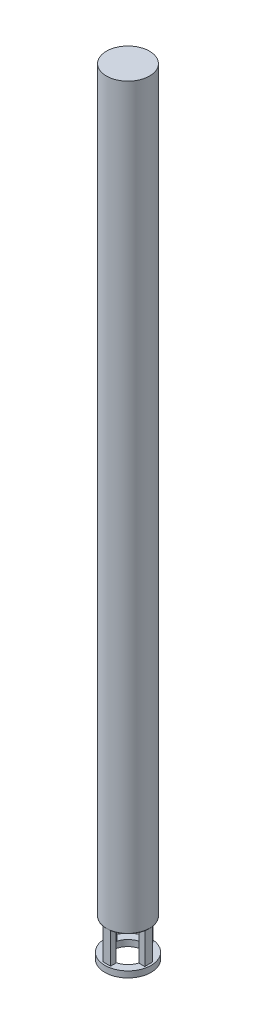
ISO-10303-21;
HEADER;
FILE_DESCRIPTION(('STEP AP214'),'2;1');
FILE_NAME('part.step','',(''),(''),'','','');
FILE_SCHEMA(('AUTOMOTIVE_DESIGN { 1 0 10303 214 1 1 1 1 }'));
ENDSEC;
DATA;
#1=APPLICATION_CONTEXT('core data for automotive mechanical design processes');
#2=APPLICATION_PROTOCOL_DEFINITION('international standard','automotive_design',2000,#1);
#3=PRODUCT_CONTEXT('',#1,'mechanical');
#4=PRODUCT('Part','Part','',(#3));
#5=PRODUCT_RELATED_PRODUCT_CATEGORY('part','',(#4));
#6=PRODUCT_DEFINITION_FORMATION('','',#4);
#7=PRODUCT_DEFINITION_CONTEXT('part definition',#1,'design');
#8=PRODUCT_DEFINITION('design','',#6,#7);
#9=PRODUCT_DEFINITION_SHAPE('','',#8);
#10=(LENGTH_UNIT() NAMED_UNIT(*) SI_UNIT(.MILLI.,.METRE.));
#11=(NAMED_UNIT(*) PLANE_ANGLE_UNIT() SI_UNIT($,.RADIAN.));
#12=(NAMED_UNIT(*) SI_UNIT($,.STERADIAN.) SOLID_ANGLE_UNIT());
#13=UNCERTAINTY_MEASURE_WITH_UNIT(LENGTH_MEASURE(1.E-05),#10,'distance_accuracy_value','');
#14=(GEOMETRIC_REPRESENTATION_CONTEXT(3) GLOBAL_UNCERTAINTY_ASSIGNED_CONTEXT((#13)) GLOBAL_UNIT_ASSIGNED_CONTEXT((#10,
#11,#12)) REPRESENTATION_CONTEXT('',''));
#15=CARTESIAN_POINT('',(0.,0.,0.));
#16=DIRECTION('',(0.,0.,1.));
#17=DIRECTION('',(1.,0.,0.));
#18=AXIS2_PLACEMENT_3D('',#15,#16,#17);
#19=CARTESIAN_POINT('',(0.,-5.,0.));
#20=DIRECTION('',(0.,1.,0.));
#21=DIRECTION('',(0.,0.,1.));
#22=AXIS2_PLACEMENT_3D('',#19,#20,#21);
#23=PLANE('',#22);
#24=DIRECTION('',(0.,0.,-1.));
#25=VECTOR('',#24,1.);
#26=CARTESIAN_POINT('',(-0.674999999999977,-5.,3.4));
#27=LINE('',#26,#25);
#28=CARTESIAN_POINT('',(-0.674999999999977,-5.,3.4));
#29=VERTEX_POINT('',#28);
#30=CARTESIAN_POINT('',(-0.674999999999983,-5.,2.5));
#31=VERTEX_POINT('',#30);
#32=EDGE_CURVE('E67',#29,#31,#27,.T.);
#33=ORIENTED_EDGE('',*,*,#32,.T.);
#34=DIRECTION('',(1.,0.,0.));
#35=VECTOR('',#34,1.);
#36=CARTESIAN_POINT('',(-0.674999999999983,-5.,2.5));
#37=LINE('',#36,#35);
#38=CARTESIAN_POINT('',(0.,-5.,2.5));
#39=VERTEX_POINT('',#38);
#40=EDGE_CURVE('E546',#31,#39,#37,.T.);
#41=ORIENTED_EDGE('',*,*,#40,.T.);
#42=CARTESIAN_POINT('',(0.,-5.,0.));
#43=DIRECTION('',(0.,1.,0.));
#44=DIRECTION('',(0.,0.,1.));
#45=AXIS2_PLACEMENT_3D('',#42,#43,#44);
#46=CIRCLE('',#45,2.5);
#47=CARTESIAN_POINT('',(-2.5,-5.,0.));
#48=VERTEX_POINT('',#47);
#49=EDGE_CURVE('E554',#48,#39,#46,.T.);
#50=ORIENTED_EDGE('',*,*,#49,.F.);
#51=DIRECTION('',(0.,0.,1.));
#52=VECTOR('',#51,1.);
#53=CARTESIAN_POINT('',(-2.5,-5.,-0.674999999999988));
#54=LINE('',#53,#52);
#55=CARTESIAN_POINT('',(-2.5,-5.,0.575000000000012));
#56=VERTEX_POINT('',#55);
#57=EDGE_CURVE('E216',#48,#56,#54,.T.);
#58=ORIENTED_EDGE('',*,*,#57,.T.);
#59=DIRECTION('',(-1.,0.,0.));
#60=VECTOR('',#59,1.);
#61=CARTESIAN_POINT('',(-3.4,-5.,0.575000000000016));
#62=LINE('',#61,#60);
#63=CARTESIAN_POINT('',(-3.4,-5.,0.575000000000016));
#64=VERTEX_POINT('',#63);
#65=EDGE_CURVE('E220',#56,#64,#62,.T.);
#66=ORIENTED_EDGE('',*,*,#65,.T.);
#67=DIRECTION('',(0.,0.,-1.));
#68=VECTOR('',#67,1.);
#69=CARTESIAN_POINT('',(-3.4,-5.,-0.674999999999984));
#70=LINE('',#69,#68);
#71=CARTESIAN_POINT('',(-3.4,-5.,-0.674999999999984));
#72=VERTEX_POINT('',#71);
#73=EDGE_CURVE('E218',#64,#72,#70,.T.);
#74=ORIENTED_EDGE('',*,*,#73,.T.);
#75=DIRECTION('',(1.,0.,0.));
#76=VECTOR('',#75,1.);
#77=CARTESIAN_POINT('',(-3.4,-5.,-0.674999999999984));
#78=LINE('',#77,#76);
#79=CARTESIAN_POINT('',(-2.5,-5.,-0.674999999999988));
#80=VERTEX_POINT('',#79);
#81=EDGE_CURVE('E215',#72,#80,#78,.T.);
#82=ORIENTED_EDGE('',*,*,#81,.T.);
#83=EDGE_CURVE('E213',#80,#48,#54,.T.);
#84=ORIENTED_EDGE('',*,*,#83,.T.);
#85=CARTESIAN_POINT('',(0.,-5.,-2.5));
#86=VERTEX_POINT('',#85);
#87=EDGE_CURVE('E304',#86,#48,#46,.T.);
#88=ORIENTED_EDGE('',*,*,#87,.F.);
#89=DIRECTION('',(-1.,0.,0.));
#90=VECTOR('',#89,1.);
#91=CARTESIAN_POINT('',(0.674999999999994,-5.,-2.5));
#92=LINE('',#91,#90);
#93=CARTESIAN_POINT('',(-0.575000000000006,-5.,-2.5));
#94=VERTEX_POINT('',#93);
#95=EDGE_CURVE('E245',#86,#94,#92,.T.);
#96=ORIENTED_EDGE('',*,*,#95,.T.);
#97=DIRECTION('',(0.,0.,-1.));
#98=VECTOR('',#97,1.);
#99=CARTESIAN_POINT('',(-0.575000000000008,-5.,-3.4));
#100=LINE('',#99,#98);
#101=CARTESIAN_POINT('',(-0.575000000000008,-5.,-3.4));
#102=VERTEX_POINT('',#101);
#103=EDGE_CURVE('E249',#94,#102,#100,.T.);
#104=ORIENTED_EDGE('',*,*,#103,.T.);
#105=DIRECTION('',(1.,0.,0.));
#106=VECTOR('',#105,1.);
#107=CARTESIAN_POINT('',(0.674999999999992,-5.,-3.4));
#108=LINE('',#107,#106);
#109=CARTESIAN_POINT('',(0.674999999999992,-5.,-3.4));
#110=VERTEX_POINT('',#109);
#111=EDGE_CURVE('E247',#102,#110,#108,.T.);
#112=ORIENTED_EDGE('',*,*,#111,.T.);
#113=DIRECTION('',(0.,0.,1.));
#114=VECTOR('',#113,1.);
#115=CARTESIAN_POINT('',(0.674999999999992,-5.,-3.4));
#116=LINE('',#115,#114);
#117=CARTESIAN_POINT('',(0.674999999999994,-5.,-2.5));
#118=VERTEX_POINT('',#117);
#119=EDGE_CURVE('E244',#110,#118,#116,.T.);
#120=ORIENTED_EDGE('',*,*,#119,.T.);
#121=EDGE_CURVE('E242',#118,#86,#92,.T.);
#122=ORIENTED_EDGE('',*,*,#121,.T.);
#123=CARTESIAN_POINT('',(2.5,-5.,0.));
#124=VERTEX_POINT('',#123);
#125=EDGE_CURVE('E301',#124,#86,#46,.T.);
#126=ORIENTED_EDGE('',*,*,#125,.F.);
#127=DIRECTION('',(0.,0.,-1.));
#128=VECTOR('',#127,1.);
#129=CARTESIAN_POINT('',(2.5,-5.,0.675));
#130=LINE('',#129,#128);
#131=CARTESIAN_POINT('',(2.5,-5.,-0.575));
#132=VERTEX_POINT('',#131);
#133=EDGE_CURVE('E12',#124,#132,#130,.T.);
#134=ORIENTED_EDGE('',*,*,#133,.T.);
#135=DIRECTION('',(1.,0.,0.));
#136=VECTOR('',#135,1.);
#137=CARTESIAN_POINT('',(3.4,-5.,-0.575));
#138=LINE('',#137,#136);
#139=CARTESIAN_POINT('',(3.4,-5.,-0.575));
#140=VERTEX_POINT('',#139);
#141=EDGE_CURVE('E279',#132,#140,#138,.T.);
#142=ORIENTED_EDGE('',*,*,#141,.T.);
#143=DIRECTION('',(0.,0.,1.));
#144=VECTOR('',#143,1.);
#145=CARTESIAN_POINT('',(3.4,-5.,0.675));
#146=LINE('',#145,#144);
#147=CARTESIAN_POINT('',(3.4,-5.,0.675));
#148=VERTEX_POINT('',#147);
#149=EDGE_CURVE('E276',#140,#148,#146,.T.);
#150=ORIENTED_EDGE('',*,*,#149,.T.);
#151=DIRECTION('',(-1.,0.,0.));
#152=VECTOR('',#151,1.);
#153=CARTESIAN_POINT('',(3.4,-5.,0.675));
#154=LINE('',#153,#152);
#155=CARTESIAN_POINT('',(2.5,-5.,0.675));
#156=VERTEX_POINT('',#155);
#157=EDGE_CURVE('E272',#148,#156,#154,.T.);
#158=ORIENTED_EDGE('',*,*,#157,.T.);
#159=EDGE_CURVE('E60',#156,#124,#130,.T.);
#160=ORIENTED_EDGE('',*,*,#159,.T.);
#161=EDGE_CURVE('E305',#39,#124,#46,.T.);
#162=ORIENTED_EDGE('',*,*,#161,.F.);
#163=CARTESIAN_POINT('',(0.575000000000017,-5.,2.5));
#164=VERTEX_POINT('',#163);
#165=EDGE_CURVE('E206',#39,#164,#37,.T.);
#166=ORIENTED_EDGE('',*,*,#165,.T.);
#167=DIRECTION('',(0.,0.,1.));
#168=VECTOR('',#167,1.);
#169=CARTESIAN_POINT('',(0.575000000000023,-5.,3.4));
#170=LINE('',#169,#168);
#171=CARTESIAN_POINT('',(0.575000000000023,-5.,3.4));
#172=VERTEX_POINT('',#171);
#173=EDGE_CURVE('E210',#164,#172,#170,.T.);
#174=ORIENTED_EDGE('',*,*,#173,.T.);
#175=DIRECTION('',(-1.,0.,0.));
#176=VECTOR('',#175,1.);
#177=CARTESIAN_POINT('',(-0.674999999999977,-5.,3.4));
#178=LINE('',#177,#176);
#179=EDGE_CURVE('E72',#172,#29,#178,.T.);
#180=ORIENTED_EDGE('',*,*,#179,.T.);
#181=EDGE_LOOP('',(#33,#41,#50,#58,#66,#74,#82,#84,#88,#96,#104,#112,#120,#122,#126,#134,#142,
#150,#158,#160,#162,#166,#174,#180));
#182=FACE_BOUND('',#181,.T.);
#183=CARTESIAN_POINT('',(0.,-5.,0.));
#184=DIRECTION('',(0.,1.,0.));
#185=DIRECTION('',(0.,0.,1.));
#186=AXIS2_PLACEMENT_3D('',#183,#184,#185);
#187=CIRCLE('',#186,3.75);
#188=CARTESIAN_POINT('',(0.,-5.,3.75));
#189=VERTEX_POINT('',#188);
#190=EDGE_CURVE('E58',#189,#189,#187,.T.);
#191=ORIENTED_EDGE('',*,*,#190,.T.);
#192=EDGE_LOOP('',(#191));
#193=FACE_BOUND('',#192,.T.);
#194=ADVANCED_FACE('F49',(#182,#193),#23,.T.);
#195=CARTESIAN_POINT('',(0.,-6.,0.));
#196=DIRECTION('',(0.,1.,0.));
#197=DIRECTION('',(0.,0.,1.));
#198=AXIS2_PLACEMENT_3D('',#195,#196,#197);
#199=PLANE('',#198);
#200=CARTESIAN_POINT('',(0.,-6.,0.));
#201=DIRECTION('',(0.,1.,0.));
#202=DIRECTION('',(0.,0.,1.));
#203=AXIS2_PLACEMENT_3D('',#200,#201,#202);
#204=CIRCLE('',#203,3.75);
#205=CARTESIAN_POINT('',(0.,-6.,3.75));
#206=VERTEX_POINT('',#205);
#207=EDGE_CURVE('E53',#206,#206,#204,.T.);
#208=ORIENTED_EDGE('',*,*,#207,.F.);
#209=EDGE_LOOP('',(#208));
#210=FACE_BOUND('',#209,.T.);
#211=CARTESIAN_POINT('',(0.,-6.,0.));
#212=DIRECTION('',(0.,1.,0.));
#213=DIRECTION('',(0.,0.,1.));
#214=AXIS2_PLACEMENT_3D('',#211,#212,#213);
#215=CIRCLE('',#214,2.5);
#216=CARTESIAN_POINT('',(0.,-6.,2.5));
#217=VERTEX_POINT('',#216);
#218=EDGE_CURVE('E300',#217,#217,#215,.T.);
#219=ORIENTED_EDGE('',*,*,#218,.T.);
#220=EDGE_LOOP('',(#219));
#221=FACE_BOUND('',#220,.T.);
#222=ADVANCED_FACE('F314',(#210,#221),#199,.F.);
#223=CARTESIAN_POINT('',(0.,-5.,0.));
#224=DIRECTION('',(0.,-1.,0.));
#225=DIRECTION('',(0.,0.,-1.));
#226=AXIS2_PLACEMENT_3D('',#223,#224,#225);
#227=CYLINDRICAL_SURFACE('',#226,3.75);
#228=ORIENTED_EDGE('',*,*,#190,.F.);
#229=EDGE_LOOP('',(#228));
#230=FACE_BOUND('',#229,.T.);
#231=ORIENTED_EDGE('',*,*,#207,.T.);
#232=EDGE_LOOP('',(#231));
#233=FACE_BOUND('',#232,.T.);
#234=ADVANCED_FACE('F51',(#230,#233),#227,.T.);
#235=CARTESIAN_POINT('',(0.,-5.,0.));
#236=DIRECTION('',(0.,-1.,0.));
#237=DIRECTION('',(0.,0.,-1.));
#238=AXIS2_PLACEMENT_3D('',#235,#236,#237);
#239=CYLINDRICAL_SURFACE('',#238,2.5);
#240=ORIENTED_EDGE('',*,*,#125,.T.);
#241=ORIENTED_EDGE('',*,*,#87,.T.);
#242=ORIENTED_EDGE('',*,*,#49,.T.);
#243=ORIENTED_EDGE('',*,*,#161,.T.);
#244=EDGE_LOOP('',(#240,#241,#242,#243));
#245=FACE_BOUND('',#244,.T.);
#246=ORIENTED_EDGE('',*,*,#218,.F.);
#247=EDGE_LOOP('',(#246));
#248=FACE_BOUND('',#247,.T.);
#249=ADVANCED_FACE('F319',(#245,#248),#239,.F.);
#250=CARTESIAN_POINT('',(3.4,-6.54029218007494,0.675));
#251=DIRECTION('',(1.,0.,0.));
#252=DIRECTION('',(0.,0.,-1.));
#253=AXIS2_PLACEMENT_3D('',#250,#251,#252);
#254=PLANE('',#253);
#255=ORIENTED_EDGE('',*,*,#149,.F.);
#256=DIRECTION('',(0.,1.,0.));
#257=VECTOR('',#256,1.);
#258=CARTESIAN_POINT('',(3.4,-6.54029218007494,-0.575));
#259=LINE('',#258,#257);
#260=CARTESIAN_POINT('',(3.4,0.,-0.575));
#261=VERTEX_POINT('',#260);
#262=EDGE_CURVE('E291',#140,#261,#259,.T.);
#263=ORIENTED_EDGE('',*,*,#262,.T.);
#264=DIRECTION('',(0.,0.,-1.));
#265=VECTOR('',#264,1.);
#266=CARTESIAN_POINT('',(3.4,0.,0.675));
#267=LINE('',#266,#265);
#268=CARTESIAN_POINT('',(3.4,0.,0.675));
#269=VERTEX_POINT('',#268);
#270=EDGE_CURVE('E269',#269,#261,#267,.T.);
#271=ORIENTED_EDGE('',*,*,#270,.F.);
#272=DIRECTION('',(0.,1.,0.));
#273=VECTOR('',#272,1.);
#274=CARTESIAN_POINT('',(3.4,-6.54029218007494,0.675));
#275=LINE('',#274,#273);
#276=EDGE_CURVE('E273',#148,#269,#275,.T.);
#277=ORIENTED_EDGE('',*,*,#276,.F.);
#278=EDGE_LOOP('',(#255,#263,#271,#277));
#279=FACE_BOUND('',#278,.T.);
#280=ADVANCED_FACE('F321',(#279),#254,.T.);
#281=CARTESIAN_POINT('',(3.4,-6.54029218007494,0.675));
#282=DIRECTION('',(0.,0.,1.));
#283=DIRECTION('',(1.,0.,0.));
#284=AXIS2_PLACEMENT_3D('',#281,#282,#283);
#285=PLANE('',#284);
#286=ORIENTED_EDGE('',*,*,#157,.F.);
#287=ORIENTED_EDGE('',*,*,#276,.T.);
#288=DIRECTION('',(1.,0.,0.));
#289=VECTOR('',#288,1.);
#290=CARTESIAN_POINT('',(3.4,0.,0.675));
#291=LINE('',#290,#289);
#292=CARTESIAN_POINT('',(2.5,0.,0.675));
#293=VERTEX_POINT('',#292);
#294=EDGE_CURVE('E288',#293,#269,#291,.T.);
#295=ORIENTED_EDGE('',*,*,#294,.F.);
#296=DIRECTION('',(0.,1.,0.));
#297=VECTOR('',#296,1.);
#298=CARTESIAN_POINT('',(2.5,-6.54029218007494,0.675));
#299=LINE('',#298,#297);
#300=EDGE_CURVE('E293',#156,#293,#299,.T.);
#301=ORIENTED_EDGE('',*,*,#300,.F.);
#302=EDGE_LOOP('',(#286,#287,#295,#301));
#303=FACE_BOUND('',#302,.T.);
#304=ADVANCED_FACE('F329',(#303),#285,.T.);
#305=CARTESIAN_POINT('',(2.5,-6.54029218007494,0.675));
#306=DIRECTION('',(-1.,0.,0.));
#307=DIRECTION('',(0.,0.,1.));
#308=AXIS2_PLACEMENT_3D('',#305,#306,#307);
#309=PLANE('',#308);
#310=ORIENTED_EDGE('',*,*,#159,.F.);
#311=ORIENTED_EDGE('',*,*,#300,.T.);
#312=DIRECTION('',(0.,0.,1.));
#313=VECTOR('',#312,1.);
#314=CARTESIAN_POINT('',(2.5,0.,0.675));
#315=LINE('',#314,#313);
#316=CARTESIAN_POINT('',(2.5,0.,-0.575));
#317=VERTEX_POINT('',#316);
#318=EDGE_CURVE('E285',#317,#293,#315,.T.);
#319=ORIENTED_EDGE('',*,*,#318,.F.);
#320=DIRECTION('',(0.,1.,0.));
#321=VECTOR('',#320,1.);
#322=CARTESIAN_POINT('',(2.5,-6.54029218007494,-0.575));
#323=LINE('',#322,#321);
#324=EDGE_CURVE('E295',#132,#317,#323,.T.);
#325=ORIENTED_EDGE('',*,*,#324,.F.);
#326=ORIENTED_EDGE('',*,*,#133,.F.);
#327=EDGE_LOOP('',(#310,#311,#319,#325,#326));
#328=FACE_BOUND('',#327,.T.);
#329=ADVANCED_FACE('F357',(#328),#309,.T.);
#330=CARTESIAN_POINT('',(3.4,-6.54029218007494,-0.575));
#331=DIRECTION('',(0.,0.,-1.));
#332=DIRECTION('',(-1.,0.,0.));
#333=AXIS2_PLACEMENT_3D('',#330,#331,#332);
#334=PLANE('',#333);
#335=ORIENTED_EDGE('',*,*,#141,.F.);
#336=ORIENTED_EDGE('',*,*,#324,.T.);
#337=DIRECTION('',(-1.,0.,0.));
#338=VECTOR('',#337,1.);
#339=CARTESIAN_POINT('',(3.4,0.,-0.575));
#340=LINE('',#339,#338);
#341=EDGE_CURVE('E282',#261,#317,#340,.T.);
#342=ORIENTED_EDGE('',*,*,#341,.F.);
#343=ORIENTED_EDGE('',*,*,#262,.F.);
#344=EDGE_LOOP('',(#335,#336,#342,#343));
#345=FACE_BOUND('',#344,.T.);
#346=ADVANCED_FACE('F347',(#345),#334,.T.);
#347=CARTESIAN_POINT('',(0.,0.,0.));
#348=DIRECTION('',(0.,1.,0.));
#349=DIRECTION('',(0.,0.,1.));
#350=AXIS2_PLACEMENT_3D('',#347,#348,#349);
#351=PLANE('',#350);
#352=ORIENTED_EDGE('',*,*,#270,.T.);
#353=ORIENTED_EDGE('',*,*,#341,.T.);
#354=ORIENTED_EDGE('',*,*,#318,.T.);
#355=ORIENTED_EDGE('',*,*,#294,.T.);
#356=EDGE_LOOP('',(#352,#353,#354,#355));
#357=FACE_BOUND('',#356,.T.);
#358=ADVANCED_FACE('F342',(#357),#351,.T.);
#359=CARTESIAN_POINT('',(0.674999999999992,-6.54029218007494,-3.4));
#360=DIRECTION('',(0.,0.,-1.));
#361=DIRECTION('',(-1.,0.,0.));
#362=AXIS2_PLACEMENT_3D('',#359,#360,#361);
#363=PLANE('',#362);
#364=ORIENTED_EDGE('',*,*,#111,.F.);
#365=DIRECTION('',(0.,1.,0.));
#366=VECTOR('',#365,1.);
#367=CARTESIAN_POINT('',(-0.575000000000008,-6.54029218007494,-3.4));
#368=LINE('',#367,#366);
#369=CARTESIAN_POINT('',(-0.575000000000008,0.,-3.4));
#370=VERTEX_POINT('',#369);
#371=EDGE_CURVE('E261',#102,#370,#368,.T.);
#372=ORIENTED_EDGE('',*,*,#371,.T.);
#373=DIRECTION('',(-1.,0.,0.));
#374=VECTOR('',#373,1.);
#375=CARTESIAN_POINT('',(0.674999999999992,0.,-3.4));
#376=LINE('',#375,#374);
#377=CARTESIAN_POINT('',(0.674999999999992,0.,-3.4));
#378=VERTEX_POINT('',#377);
#379=EDGE_CURVE('E241',#378,#370,#376,.T.);
#380=ORIENTED_EDGE('',*,*,#379,.F.);
#381=DIRECTION('',(0.,1.,0.));
#382=VECTOR('',#381,1.);
#383=CARTESIAN_POINT('',(0.674999999999992,-6.54029218007494,-3.4));
#384=LINE('',#383,#382);
#385=EDGE_CURVE('E262',#110,#378,#384,.T.);
#386=ORIENTED_EDGE('',*,*,#385,.F.);
#387=EDGE_LOOP('',(#364,#372,#380,#386));
#388=FACE_BOUND('',#387,.T.);
#389=ADVANCED_FACE('F346',(#388),#363,.T.);
#390=CARTESIAN_POINT('',(0.674999999999992,-6.54029218007494,-3.4));
#391=DIRECTION('',(1.,0.,0.));
#392=DIRECTION('',(0.,0.,-1.));
#393=AXIS2_PLACEMENT_3D('',#390,#391,#392);
#394=PLANE('',#393);
#395=ORIENTED_EDGE('',*,*,#119,.F.);
#396=ORIENTED_EDGE('',*,*,#385,.T.);
#397=DIRECTION('',(0.,0.,-1.));
#398=VECTOR('',#397,1.);
#399=CARTESIAN_POINT('',(0.674999999999992,0.,-3.4));
#400=LINE('',#399,#398);
#401=CARTESIAN_POINT('',(0.674999999999994,0.,-2.5));
#402=VERTEX_POINT('',#401);
#403=EDGE_CURVE('E258',#402,#378,#400,.T.);
#404=ORIENTED_EDGE('',*,*,#403,.F.);
#405=DIRECTION('',(0.,1.,0.));
#406=VECTOR('',#405,1.);
#407=CARTESIAN_POINT('',(0.674999999999994,-6.54029218007494,-2.5));
#408=LINE('',#407,#406);
#409=EDGE_CURVE('E264',#118,#402,#408,.T.);
#410=ORIENTED_EDGE('',*,*,#409,.F.);
#411=EDGE_LOOP('',(#395,#396,#404,#410));
#412=FACE_BOUND('',#411,.T.);
#413=ADVANCED_FACE('F407',(#412),#394,.T.);
#414=CARTESIAN_POINT('',(0.674999999999994,-6.54029218007494,-2.5));
#415=DIRECTION('',(0.,0.,1.));
#416=DIRECTION('',(1.,0.,0.));
#417=AXIS2_PLACEMENT_3D('',#414,#415,#416);
#418=PLANE('',#417);
#419=ORIENTED_EDGE('',*,*,#121,.F.);
#420=ORIENTED_EDGE('',*,*,#409,.T.);
#421=DIRECTION('',(1.,0.,0.));
#422=VECTOR('',#421,1.);
#423=CARTESIAN_POINT('',(0.674999999999994,0.,-2.5));
#424=LINE('',#423,#422);
#425=CARTESIAN_POINT('',(-0.575000000000006,0.,-2.5));
#426=VERTEX_POINT('',#425);
#427=EDGE_CURVE('E255',#426,#402,#424,.T.);
#428=ORIENTED_EDGE('',*,*,#427,.F.);
#429=DIRECTION('',(0.,1.,0.));
#430=VECTOR('',#429,1.);
#431=CARTESIAN_POINT('',(-0.575000000000006,-6.54029218007494,-2.5));
#432=LINE('',#431,#430);
#433=EDGE_CURVE('E266',#94,#426,#432,.T.);
#434=ORIENTED_EDGE('',*,*,#433,.F.);
#435=ORIENTED_EDGE('',*,*,#95,.F.);
#436=EDGE_LOOP('',(#419,#420,#428,#434,#435));
#437=FACE_BOUND('',#436,.T.);
#438=ADVANCED_FACE('F416',(#437),#418,.T.);
#439=CARTESIAN_POINT('',(-0.575000000000008,-6.54029218007494,-3.4));
#440=DIRECTION('',(-1.,0.,0.));
#441=DIRECTION('',(0.,0.,1.));
#442=AXIS2_PLACEMENT_3D('',#439,#440,#441);
#443=PLANE('',#442);
#444=ORIENTED_EDGE('',*,*,#103,.F.);
#445=ORIENTED_EDGE('',*,*,#433,.T.);
#446=DIRECTION('',(0.,0.,1.));
#447=VECTOR('',#446,1.);
#448=CARTESIAN_POINT('',(-0.575000000000008,0.,-3.4));
#449=LINE('',#448,#447);
#450=EDGE_CURVE('E252',#370,#426,#449,.T.);
#451=ORIENTED_EDGE('',*,*,#450,.F.);
#452=ORIENTED_EDGE('',*,*,#371,.F.);
#453=EDGE_LOOP('',(#444,#445,#451,#452));
#454=FACE_BOUND('',#453,.T.);
#455=ADVANCED_FACE('F425',(#454),#443,.T.);
#456=CARTESIAN_POINT('',(0.,0.,0.));
#457=DIRECTION('',(0.,1.,0.));
#458=DIRECTION('',(1.,0.,0.));
#459=AXIS2_PLACEMENT_3D('',#456,#457,#458);
#460=PLANE('',#459);
#461=ORIENTED_EDGE('',*,*,#379,.T.);
#462=ORIENTED_EDGE('',*,*,#450,.T.);
#463=ORIENTED_EDGE('',*,*,#427,.T.);
#464=ORIENTED_EDGE('',*,*,#403,.T.);
#465=EDGE_LOOP('',(#461,#462,#463,#464));
#466=FACE_BOUND('',#465,.T.);
#467=ADVANCED_FACE('F434',(#466),#460,.T.);
#468=CARTESIAN_POINT('',(-3.4,-6.54029218007494,-0.674999999999984));
#469=DIRECTION('',(-1.,0.,0.));
#470=DIRECTION('',(0.,0.,1.));
#471=AXIS2_PLACEMENT_3D('',#468,#469,#470);
#472=PLANE('',#471);
#473=ORIENTED_EDGE('',*,*,#73,.F.);
#474=DIRECTION('',(0.,1.,0.));
#475=VECTOR('',#474,1.);
#476=CARTESIAN_POINT('',(-3.4,-6.54029218007494,0.575000000000016));
#477=LINE('',#476,#475);
#478=CARTESIAN_POINT('',(-3.4,0.,0.575000000000016));
#479=VERTEX_POINT('',#478);
#480=EDGE_CURVE('E232',#64,#479,#477,.T.);
#481=ORIENTED_EDGE('',*,*,#480,.T.);
#482=DIRECTION('',(0.,0.,1.));
#483=VECTOR('',#482,1.);
#484=CARTESIAN_POINT('',(-3.4,0.,-0.674999999999984));
#485=LINE('',#484,#483);
#486=CARTESIAN_POINT('',(-3.4,0.,-0.674999999999984));
#487=VERTEX_POINT('',#486);
#488=EDGE_CURVE('E212',#487,#479,#485,.T.);
#489=ORIENTED_EDGE('',*,*,#488,.F.);
#490=DIRECTION('',(0.,1.,0.));
#491=VECTOR('',#490,1.);
#492=CARTESIAN_POINT('',(-3.4,-6.54029218007494,-0.674999999999984));
#493=LINE('',#492,#491);
#494=EDGE_CURVE('E233',#72,#487,#493,.T.);
#495=ORIENTED_EDGE('',*,*,#494,.F.);
#496=EDGE_LOOP('',(#473,#481,#489,#495));
#497=FACE_BOUND('',#496,.T.);
#498=ADVANCED_FACE('F443',(#497),#472,.T.);
#499=CARTESIAN_POINT('',(-3.4,-6.54029218007494,-0.674999999999984));
#500=DIRECTION('',(0.,0.,-1.));
#501=DIRECTION('',(-1.,0.,0.));
#502=AXIS2_PLACEMENT_3D('',#499,#500,#501);
#503=PLANE('',#502);
#504=ORIENTED_EDGE('',*,*,#81,.F.);
#505=ORIENTED_EDGE('',*,*,#494,.T.);
#506=DIRECTION('',(-1.,0.,0.));
#507=VECTOR('',#506,1.);
#508=CARTESIAN_POINT('',(-3.4,0.,-0.674999999999984));
#509=LINE('',#508,#507);
#510=CARTESIAN_POINT('',(-2.5,0.,-0.674999999999988));
#511=VERTEX_POINT('',#510);
#512=EDGE_CURVE('E229',#511,#487,#509,.T.);
#513=ORIENTED_EDGE('',*,*,#512,.F.);
#514=DIRECTION('',(0.,1.,0.));
#515=VECTOR('',#514,1.);
#516=CARTESIAN_POINT('',(-2.5,-6.54029218007494,-0.674999999999988));
#517=LINE('',#516,#515);
#518=EDGE_CURVE('E235',#80,#511,#517,.T.);
#519=ORIENTED_EDGE('',*,*,#518,.F.);
#520=EDGE_LOOP('',(#504,#505,#513,#519));
#521=FACE_BOUND('',#520,.T.);
#522=ADVANCED_FACE('F452',(#521),#503,.T.);
#523=CARTESIAN_POINT('',(-2.5,-6.54029218007494,-0.674999999999988));
#524=DIRECTION('',(1.,0.,0.));
#525=DIRECTION('',(0.,0.,-1.));
#526=AXIS2_PLACEMENT_3D('',#523,#524,#525);
#527=PLANE('',#526);
#528=ORIENTED_EDGE('',*,*,#83,.F.);
#529=ORIENTED_EDGE('',*,*,#518,.T.);
#530=DIRECTION('',(0.,0.,-1.));
#531=VECTOR('',#530,1.);
#532=CARTESIAN_POINT('',(-2.5,0.,-0.674999999999988));
#533=LINE('',#532,#531);
#534=CARTESIAN_POINT('',(-2.5,0.,0.575000000000012));
#535=VERTEX_POINT('',#534);
#536=EDGE_CURVE('E226',#535,#511,#533,.T.);
#537=ORIENTED_EDGE('',*,*,#536,.F.);
#538=DIRECTION('',(0.,1.,0.));
#539=VECTOR('',#538,1.);
#540=CARTESIAN_POINT('',(-2.5,-6.54029218007494,0.575000000000012));
#541=LINE('',#540,#539);
#542=EDGE_CURVE('E237',#56,#535,#541,.T.);
#543=ORIENTED_EDGE('',*,*,#542,.F.);
#544=ORIENTED_EDGE('',*,*,#57,.F.);
#545=EDGE_LOOP('',(#528,#529,#537,#543,#544));
#546=FACE_BOUND('',#545,.T.);
#547=ADVANCED_FACE('F461',(#546),#527,.T.);
#548=CARTESIAN_POINT('',(-3.4,-6.54029218007494,0.575000000000016));
#549=DIRECTION('',(0.,0.,1.));
#550=DIRECTION('',(1.,0.,0.));
#551=AXIS2_PLACEMENT_3D('',#548,#549,#550);
#552=PLANE('',#551);
#553=ORIENTED_EDGE('',*,*,#65,.F.);
#554=ORIENTED_EDGE('',*,*,#542,.T.);
#555=DIRECTION('',(1.,0.,0.));
#556=VECTOR('',#555,1.);
#557=CARTESIAN_POINT('',(-3.4,0.,0.575000000000016));
#558=LINE('',#557,#556);
#559=EDGE_CURVE('E223',#479,#535,#558,.T.);
#560=ORIENTED_EDGE('',*,*,#559,.F.);
#561=ORIENTED_EDGE('',*,*,#480,.F.);
#562=EDGE_LOOP('',(#553,#554,#560,#561));
#563=FACE_BOUND('',#562,.T.);
#564=ADVANCED_FACE('F470',(#563),#552,.T.);
#565=CARTESIAN_POINT('',(0.,0.,0.));
#566=DIRECTION('',(0.,1.,0.));
#567=DIRECTION('',(0.,0.,-1.));
#568=AXIS2_PLACEMENT_3D('',#565,#566,#567);
#569=PLANE('',#568);
#570=ORIENTED_EDGE('',*,*,#488,.T.);
#571=ORIENTED_EDGE('',*,*,#559,.T.);
#572=ORIENTED_EDGE('',*,*,#536,.T.);
#573=ORIENTED_EDGE('',*,*,#512,.T.);
#574=EDGE_LOOP('',(#570,#571,#572,#573));
#575=FACE_BOUND('',#574,.T.);
#576=ADVANCED_FACE('F479',(#575),#569,.T.);
#577=CARTESIAN_POINT('',(-0.674999999999977,-6.54029218007495,3.4));
#578=DIRECTION('',(0.,0.,1.));
#579=DIRECTION('',(1.,0.,0.));
#580=AXIS2_PLACEMENT_3D('',#577,#578,#579);
#581=PLANE('',#580);
#582=ORIENTED_EDGE('',*,*,#179,.F.);
#583=DIRECTION('',(0.,1.,0.));
#584=VECTOR('',#583,1.);
#585=CARTESIAN_POINT('',(0.575000000000023,-6.54029218007495,3.4));
#586=LINE('',#585,#584);
#587=CARTESIAN_POINT('',(0.575000000000023,0.,3.4));
#588=VERTEX_POINT('',#587);
#589=EDGE_CURVE('E175',#172,#588,#586,.T.);
#590=ORIENTED_EDGE('',*,*,#589,.T.);
#591=DIRECTION('',(1.,0.,0.));
#592=VECTOR('',#591,1.);
#593=CARTESIAN_POINT('',(-0.674999999999977,0.,3.4));
#594=LINE('',#593,#592);
#595=CARTESIAN_POINT('',(-0.674999999999977,0.,3.4));
#596=VERTEX_POINT('',#595);
#597=EDGE_CURVE('E180',#596,#588,#594,.T.);
#598=ORIENTED_EDGE('',*,*,#597,.F.);
#599=DIRECTION('',(0.,1.,0.));
#600=VECTOR('',#599,1.);
#601=CARTESIAN_POINT('',(-0.674999999999977,-6.54029218007495,3.4));
#602=LINE('',#601,#600);
#603=EDGE_CURVE('E204',#29,#596,#602,.T.);
#604=ORIENTED_EDGE('',*,*,#603,.F.);
#605=EDGE_LOOP('',(#582,#590,#598,#604));
#606=FACE_BOUND('',#605,.T.);
#607=ADVANCED_FACE('F177',(#606),#581,.T.);
#608=CARTESIAN_POINT('',(-0.674999999999977,-6.54029218007495,3.4));
#609=DIRECTION('',(-1.,0.,0.));
#610=DIRECTION('',(0.,0.,1.));
#611=AXIS2_PLACEMENT_3D('',#608,#609,#610);
#612=PLANE('',#611);
#613=ORIENTED_EDGE('',*,*,#32,.F.);
#614=ORIENTED_EDGE('',*,*,#603,.T.);
#615=DIRECTION('',(0.,0.,1.));
#616=VECTOR('',#615,1.);
#617=CARTESIAN_POINT('',(-0.674999999999977,0.,3.4));
#618=LINE('',#617,#616);
#619=CARTESIAN_POINT('',(-0.674999999999983,0.,2.5));
#620=VERTEX_POINT('',#619);
#621=EDGE_CURVE('E185',#620,#596,#618,.T.);
#622=ORIENTED_EDGE('',*,*,#621,.F.);
#623=DIRECTION('',(0.,1.,0.));
#624=VECTOR('',#623,1.);
#625=CARTESIAN_POINT('',(-0.674999999999983,-6.54029218007495,2.5));
#626=LINE('',#625,#624);
#627=EDGE_CURVE('E207',#31,#620,#626,.T.);
#628=ORIENTED_EDGE('',*,*,#627,.F.);
#629=EDGE_LOOP('',(#613,#614,#622,#628));
#630=FACE_BOUND('',#629,.T.);
#631=ADVANCED_FACE('F496',(#630),#612,.T.);
#632=CARTESIAN_POINT('',(-0.674999999999983,-6.54029218007495,2.5));
#633=DIRECTION('',(0.,0.,-1.));
#634=DIRECTION('',(-1.,0.,0.));
#635=AXIS2_PLACEMENT_3D('',#632,#633,#634);
#636=PLANE('',#635);
#637=ORIENTED_EDGE('',*,*,#40,.F.);
#638=ORIENTED_EDGE('',*,*,#627,.T.);
#639=DIRECTION('',(-1.,0.,0.));
#640=VECTOR('',#639,1.);
#641=CARTESIAN_POINT('',(-0.674999999999983,0.,2.5));
#642=LINE('',#641,#640);
#643=CARTESIAN_POINT('',(0.575000000000017,0.,2.5));
#644=VERTEX_POINT('',#643);
#645=EDGE_CURVE('E194',#644,#620,#642,.T.);
#646=ORIENTED_EDGE('',*,*,#645,.F.);
#647=DIRECTION('',(0.,1.,0.));
#648=VECTOR('',#647,1.);
#649=CARTESIAN_POINT('',(0.575000000000017,-6.54029218007495,2.5));
#650=LINE('',#649,#648);
#651=EDGE_CURVE('E184',#164,#644,#650,.T.);
#652=ORIENTED_EDGE('',*,*,#651,.F.);
#653=ORIENTED_EDGE('',*,*,#165,.F.);
#654=EDGE_LOOP('',(#637,#638,#646,#652,#653));
#655=FACE_BOUND('',#654,.T.);
#656=ADVANCED_FACE('F504',(#655),#636,.T.);
#657=CARTESIAN_POINT('',(0.575000000000023,-6.54029218007495,3.4));
#658=DIRECTION('',(1.,0.,0.));
#659=DIRECTION('',(0.,0.,-1.));
#660=AXIS2_PLACEMENT_3D('',#657,#658,#659);
#661=PLANE('',#660);
#662=ORIENTED_EDGE('',*,*,#173,.F.);
#663=ORIENTED_EDGE('',*,*,#651,.T.);
#664=DIRECTION('',(0.,0.,-1.));
#665=VECTOR('',#664,1.);
#666=CARTESIAN_POINT('',(0.575000000000023,0.,3.4));
#667=LINE('',#666,#665);
#668=EDGE_CURVE('E188',#588,#644,#667,.T.);
#669=ORIENTED_EDGE('',*,*,#668,.F.);
#670=ORIENTED_EDGE('',*,*,#589,.F.);
#671=EDGE_LOOP('',(#662,#663,#669,#670));
#672=FACE_BOUND('',#671,.T.);
#673=ADVANCED_FACE('F189',(#672),#661,.T.);
#674=CARTESIAN_POINT('',(0.,0.,0.));
#675=DIRECTION('',(0.,1.,0.));
#676=DIRECTION('',(-1.,0.,0.));
#677=AXIS2_PLACEMENT_3D('',#674,#675,#676);
#678=PLANE('',#677);
#679=ORIENTED_EDGE('',*,*,#597,.T.);
#680=ORIENTED_EDGE('',*,*,#668,.T.);
#681=ORIENTED_EDGE('',*,*,#645,.T.);
#682=ORIENTED_EDGE('',*,*,#621,.T.);
#683=EDGE_LOOP('',(#679,#680,#681,#682));
#684=FACE_BOUND('',#683,.T.);
#685=ADVANCED_FACE('F196',(#684),#678,.T.);
#686=CLOSED_SHELL('',(#194,#222,#234,#249,#280,#304,#329,#346,#358,#389,#413,#438,#455,#467,
#498,#522,#547,#564,#576,#607,#631,#656,#673,#685));
#687=MANIFOLD_SOLID_BREP('B2',#686);
#688=CARTESIAN_POINT('',(0.,0.,0.));
#689=DIRECTION('',(0.,1.,0.));
#690=DIRECTION('',(0.,0.,1.));
#691=AXIS2_PLACEMENT_3D('',#688,#689,#690);
#692=PLANE('',#691);
#693=CARTESIAN_POINT('',(0.,0.,0.));
#694=DIRECTION('',(0.,1.,0.));
#695=DIRECTION('',(0.,0.,1.));
#696=AXIS2_PLACEMENT_3D('',#693,#694,#695);
#697=CIRCLE('',#696,3.40000000000001);
#698=CARTESIAN_POINT('',(0.,0.,3.40000000000001));
#699=VERTEX_POINT('',#698);
#700=EDGE_CURVE('E607',#699,#699,#697,.F.);
#701=ORIENTED_EDGE('',*,*,#700,.T.);
#702=EDGE_LOOP('',(#701));
#703=FACE_BOUND('',#702,.T.);
#704=ADVANCED_FACE('F594',(#703),#692,.F.);
#705=CARTESIAN_POINT('',(0.,120.,0.));
#706=DIRECTION('',(0.,-1.,0.));
#707=DIRECTION('',(0.,0.,-1.));
#708=AXIS2_PLACEMENT_3D('',#705,#706,#707);
#709=PLANE('',#708);
#710=CARTESIAN_POINT('',(0.,120.,0.));
#711=DIRECTION('',(0.,-1.,0.));
#712=DIRECTION('',(0.,0.,-1.));
#713=AXIS2_PLACEMENT_3D('',#710,#711,#712);
#714=CIRCLE('',#713,3.50000000000001);
#715=CARTESIAN_POINT('',(0.,120.,-3.50000000000001));
#716=VERTEX_POINT('',#715);
#717=EDGE_CURVE('E611',#716,#716,#714,.T.);
#718=ORIENTED_EDGE('',*,*,#717,.F.);
#719=EDGE_LOOP('',(#718));
#720=FACE_BOUND('',#719,.T.);
#721=ADVANCED_FACE('F638',(#720),#709,.F.);
#722=CARTESIAN_POINT('',(0.,0.,0.));
#723=DIRECTION('',(0.,-1.,0.));
#724=DIRECTION('',(0.,0.,-1.));
#725=AXIS2_PLACEMENT_3D('',#722,#723,#724);
#726=CYLINDRICAL_SURFACE('',#725,3.50000000000001);
#727=CARTESIAN_POINT('',(-3.16227766016839,104.,-1.5));
#728=CARTESIAN_POINT('',(-3.16228717298616,104.079768933045,-1.49999038492545));
#729=CARTESIAN_POINT('',(-3.16534018013075,104.159658141642,-1.49359660659694));
#730=CARTESIAN_POINT('',(-3.17716042981266,104.317116663074,-1.46827542593982));
#731=CARTESIAN_POINT('',(-3.18594276667925,104.394679280139,-1.44931491353816));
#732=CARTESIAN_POINT('',(-3.20802619745322,104.544915941798,-1.39974825661799));
#733=CARTESIAN_POINT('',(-3.22130811955255,104.617609185344,-1.3691914561727));
#734=CARTESIAN_POINT('',(-3.25086693275558,104.756817929436,-1.29744502147729));
#735=CARTESIAN_POINT('',(-3.26714323581243,104.823334639097,-1.25625747429105));
#736=CARTESIAN_POINT('',(-3.30205565130511,104.952724915617,-1.16151711863135));
#737=CARTESIAN_POINT('',(-3.32077467653239,105.015142730815,-1.10737213961854));
#738=CARTESIAN_POINT('',(-3.3577839083269,105.1303513324,-0.989495816865004));
#739=CARTESIAN_POINT('',(-3.37607394135677,105.183138279471,-0.925760668427732));
#740=CARTESIAN_POINT('',(-3.41118222051011,105.279959504636,-0.786887444118555));
#741=CARTESIAN_POINT('',(-3.42789293367331,105.323474595131,-0.711357726755071));
#742=CARTESIAN_POINT('',(-3.4569371087723,105.396982114216,-0.553203581147173));
#743=CARTESIAN_POINT('',(-3.46927262014747,105.426980875933,-0.470582497238466));
#744=CARTESIAN_POINT('',(-3.48758735586713,105.470932510561,-0.305382130945838));
#745=CARTESIAN_POINT('',(-3.49387724164573,105.485673032483,-0.223047558846197));
#746=CARTESIAN_POINT('',(-3.50052462942355,105.501241350394,-0.0568497000057634));
#747=CARTESIAN_POINT('',(-3.50088468598069,105.502075137378,0.0270129128697421));
#748=CARTESIAN_POINT('',(-3.49581016618034,105.49020487561,0.18813420759687));
#749=CARTESIAN_POINT('',(-3.49074679776829,105.478368100026,0.26547071908609));
#750=CARTESIAN_POINT('',(-3.47591102813447,105.442987965673,0.416935858912365));
#751=CARTESIAN_POINT('',(-3.46613827891648,105.419443741787,0.491064249746497));
#752=CARTESIAN_POINT('',(-3.44263346664964,105.361046705137,0.635378985342391));
#753=CARTESIAN_POINT('',(-3.42884310391307,105.326026353825,0.70548764730497));
#754=CARTESIAN_POINT('',(-3.39863837501697,105.245841322322,0.839017665141777));
#755=CARTESIAN_POINT('',(-3.38222306678435,105.200672997734,0.902436606512513));
#756=CARTESIAN_POINT('',(-3.34696895152064,105.097595246657,1.02577392003805));
#757=CARTESIAN_POINT('',(-3.32804069559209,105.038990565104,1.08508648843664));
#758=CARTESIAN_POINT('',(-3.29078815665824,104.912648584184,1.19331308888253));
#759=CARTESIAN_POINT('',(-3.27246413723675,104.844907363126,1.24222263226406));
#760=CARTESIAN_POINT('',(-3.23783417736943,104.699110062739,1.32993971380651));
#761=CARTESIAN_POINT('',(-3.22162619167356,104.620767927155,1.36831384702014));
#762=CARTESIAN_POINT('',(-3.19424697319982,104.457855495721,1.43107385954866));
#763=CARTESIAN_POINT('',(-3.18307189830843,104.373290008339,1.45547041320372));
#764=CARTESIAN_POINT('',(-3.16799275229805,104.206413602216,1.48799335058118));
#765=CARTESIAN_POINT('',(-3.16364898851199,104.124335509702,1.49710640039856));
#766=CARTESIAN_POINT('',(-3.16146494308517,103.95972551244,1.50171565988816));
#767=CARTESIAN_POINT('',(-3.16362218505067,103.877193792445,1.49721705457354));
#768=CARTESIAN_POINT('',(-3.17374071577831,103.72006871313,1.47563239208818));
#769=CARTESIAN_POINT('',(-3.18128847435203,103.645322129815,1.45944230541441));
#770=CARTESIAN_POINT('',(-3.2007978650071,103.499677261815,1.41614006363835));
#771=CARTESIAN_POINT('',(-3.21276056926752,103.428779916727,1.38902525529709));
#772=CARTESIAN_POINT('',(-3.24038333624189,103.289395054855,1.32334189052694));
#773=CARTESIAN_POINT('',(-3.25618154123647,103.221146339091,1.28432659707743));
#774=CARTESIAN_POINT('',(-3.28950916992049,103.091824647243,1.19638562157087));
#775=CARTESIAN_POINT('',(-3.30703937060571,103.030754918895,1.14745548114547));
#776=CARTESIAN_POINT('',(-3.34369698282831,102.91198553722,1.03605747720159));
#777=CARTESIAN_POINT('',(-3.36283055507214,102.855042381414,0.972781802419178));
#778=CARTESIAN_POINT('',(-3.39913473749075,102.752432881336,0.837142334524687));
#779=CARTESIAN_POINT('',(-3.41630515097052,102.706767666506,0.764777632276183));
#780=CARTESIAN_POINT('',(-3.44690719585056,102.627958655195,0.6122903936726));
#781=CARTESIAN_POINT('',(-3.46032004460385,102.594877477224,0.532131490582582));
#782=CARTESIAN_POINT('',(-3.481738302467,102.542925100554,0.36665988151858));
#783=CARTESIAN_POINT('',(-3.48974713693763,102.524044899624,0.281350477650408));
#784=CARTESIAN_POINT('',(-3.49904040627988,102.502211271193,0.114740191834881));
#785=CARTESIAN_POINT('',(-3.50077418524233,102.498193094322,0.0336030421543038));
#786=CARTESIAN_POINT('',(-3.49858700907225,102.503297754789,-0.128169808807149));
#787=CARTESIAN_POINT('',(-3.49466715001973,102.51241804495,-0.208805604242757));
#788=CARTESIAN_POINT('',(-3.481856119328,102.542776768471,-0.364022405138257));
#789=CARTESIAN_POINT('',(-3.47316550610208,102.56352698371,-0.438716867066026));
#790=CARTESIAN_POINT('',(-3.45179100848822,102.616008031922,-0.583524431853922));
#791=CARTESIAN_POINT('',(-3.43910638916064,102.647740885924,-0.653636688669971));
#792=CARTESIAN_POINT('',(-3.41024047270083,102.722895177912,-0.790820855389581));
#793=CARTESIAN_POINT('',(-3.39392604407179,102.766783852613,-0.857608099366119));
#794=CARTESIAN_POINT('',(-3.35970811620736,102.864339964729,-0.98315957617543));
#795=CARTESIAN_POINT('',(-3.34180398968801,102.918011271178,-1.0419206185));
#796=CARTESIAN_POINT('',(-3.30477972078025,103.038195508609,-1.15419921481671));
#797=CARTESIAN_POINT('',(-3.28566570654981,103.10535800812,-1.20702595263292));
#798=CARTESIAN_POINT('',(-3.24969238680824,103.248159257542,-1.30078077887624));
#799=CARTESIAN_POINT('',(-3.23283439654743,103.323802905103,-1.34170194259386));
#800=CARTESIAN_POINT('',(-3.20355631016088,103.481573569915,-1.41018371094568));
#801=CARTESIAN_POINT('',(-3.19112824877804,103.563688623135,-1.43776832759537));
#802=CARTESIAN_POINT('',(-3.17252771438392,103.731955179915,-1.47837340972956));
#803=CARTESIAN_POINT('',(-3.16633426473115,103.818092120953,-1.49144272805065));
#804=CARTESIAN_POINT('',(-3.16275406284904,103.936398844922,-1.49899243118201));
#805=CARTESIAN_POINT('',(-3.16227386666054,103.96818985909,-1.50000383428567));
#806=CARTESIAN_POINT('',(-3.16227766016839,104.,-1.5));
#807=B_SPLINE_CURVE_WITH_KNOTS('',3,(#727,#728,#729,#730,#731,#732,#733,#734,#735,#736,#737,
#738,#739,#740,#741,#742,#743,#744,#745,#746,#747,#748,#749,#750,#751,#752,#753,#754,#755,#756,
#757,#758,#759,#760,#761,#762,#763,#764,#765,#766,#767,#768,#769,#770,#771,#772,#773,#774,#775,
#776,#777,#778,#779,#780,#781,#782,#783,#784,#785,#786,#787,#788,#789,#790,#791,#792,#793,#794,
#795,#796,#797,#798,#799,#800,#801,#802,#803,#804,#805,#806),.UNSPECIFIED.,.T.,.F.,(4,2,2,2,2,2,
2,2,2,2,2,2,2,2,2,2,2,2,2,2,2,2,2,2,2,2,2,2,2,2,2,2,2,2,2,2,2,2,2,4),(0.,0.239211516998634,
0.479055812925293,0.717890772651923,0.956678879115827,1.20974703533054,1.46291585698786,
1.7278208717374,1.99260163484399,2.24290515697656,2.49310084605822,2.72720452587285,
2.96132550725882,3.19902917219044,3.43681833943188,3.69219429883403,3.94768022455397,
4.21248245374588,4.4770821893896,4.72382987542101,4.97048358104408,5.20000580849602,
5.4295838126324,5.66914358774549,5.9088113247203,6.16934837221378,6.42991150089539,
6.69175474679388,6.95343186577333,7.19595274449672,7.43842661162275,7.67141114258536,
7.90443857025996,8.14809791325949,8.39185383353304,8.65331392763675,8.91492579368383,
9.17606486564864,9.43632235654434,9.53171478279885),.UNSPECIFIED.);
#808=CARTESIAN_POINT('',(-3.16227766016839,104.,-1.5));
#809=VERTEX_POINT('',#808);
#810=EDGE_CURVE('E598',#809,#809,#807,.T.);
#811=ORIENTED_EDGE('',*,*,#810,.T.);
#812=EDGE_LOOP('',(#811));
#813=FACE_BOUND('',#812,.T.);
#814=CARTESIAN_POINT('',(0.,0.0999999999999998,0.));
#815=DIRECTION('',(0.,1.,0.));
#816=DIRECTION('',(0.,0.,1.));
#817=AXIS2_PLACEMENT_3D('',#814,#815,#816);
#818=CIRCLE('',#817,3.50000000000001);
#819=CARTESIAN_POINT('',(0.,0.0999999999999998,3.50000000000001));
#820=VERTEX_POINT('',#819);
#821=EDGE_CURVE('E48',#820,#820,#818,.T.);
#822=ORIENTED_EDGE('',*,*,#821,.T.);
#823=EDGE_LOOP('',(#822));
#824=FACE_BOUND('',#823,.T.);
#825=ORIENTED_EDGE('',*,*,#717,.T.);
#826=EDGE_LOOP('',(#825));
#827=FACE_BOUND('',#826,.T.);
#828=ADVANCED_FACE('F623',(#813,#824,#827),#726,.T.);
#829=CARTESIAN_POINT('',(0.,0.0999999999999998,0.));
#830=DIRECTION('',(0.,1.,0.));
#831=DIRECTION('',(0.,0.,1.));
#832=AXIS2_PLACEMENT_3D('',#829,#830,#831);
#833=TOROIDAL_SURFACE('',#832,3.40000000000001,0.1);
#834=ORIENTED_EDGE('',*,*,#821,.F.);
#835=EDGE_LOOP('',(#834));
#836=FACE_BOUND('',#835,.T.);
#837=ORIENTED_EDGE('',*,*,#700,.F.);
#838=EDGE_LOOP('',(#837));
#839=FACE_BOUND('',#838,.T.);
#840=ADVANCED_FACE('F596',(#836,#839),#833,.T.);
#841=CARTESIAN_POINT('',(-11.,104.,0.));
#842=DIRECTION('',(1.,0.,0.));
#843=DIRECTION('',(0.,0.,-1.));
#844=AXIS2_PLACEMENT_3D('',#841,#842,#843);
#845=CYLINDRICAL_SURFACE('',#844,1.5);
#846=CARTESIAN_POINT('',(-1.,104.,0.));
#847=DIRECTION('',(1.,0.,0.));
#848=DIRECTION('',(0.,0.,-1.));
#849=AXIS2_PLACEMENT_3D('',#846,#847,#848);
#850=CIRCLE('',#849,1.5);
#851=CARTESIAN_POINT('',(-1.,104.,-1.5));
#852=VERTEX_POINT('',#851);
#853=EDGE_CURVE('E616',#852,#852,#850,.T.);
#854=ORIENTED_EDGE('',*,*,#853,.T.);
#855=EDGE_LOOP('',(#854));
#856=FACE_BOUND('',#855,.T.);
#857=ORIENTED_EDGE('',*,*,#810,.F.);
#858=EDGE_LOOP('',(#857));
#859=FACE_BOUND('',#858,.T.);
#860=ADVANCED_FACE('F625',(#856,#859),#845,.F.);
#861=CARTESIAN_POINT('',(-1.,104.,0.));
#862=DIRECTION('',(1.,0.,0.));
#863=DIRECTION('',(0.,0.,-1.));
#864=AXIS2_PLACEMENT_3D('',#861,#862,#863);
#865=PLANE('',#864);
#866=ORIENTED_EDGE('',*,*,#853,.F.);
#867=EDGE_LOOP('',(#866));
#868=FACE_BOUND('',#867,.T.);
#869=ADVANCED_FACE('F627',(#868),#865,.F.);
#870=CLOSED_SHELL('',(#704,#721,#828,#840,#860,#869));
#871=MANIFOLD_SOLID_BREP('B6',#870);
#872=ADVANCED_BREP_SHAPE_REPRESENTATION('',(#18,#687,#871),#14);
#873=SHAPE_DEFINITION_REPRESENTATION(#9,#872);
ENDSEC;
END-ISO-10303-21;
